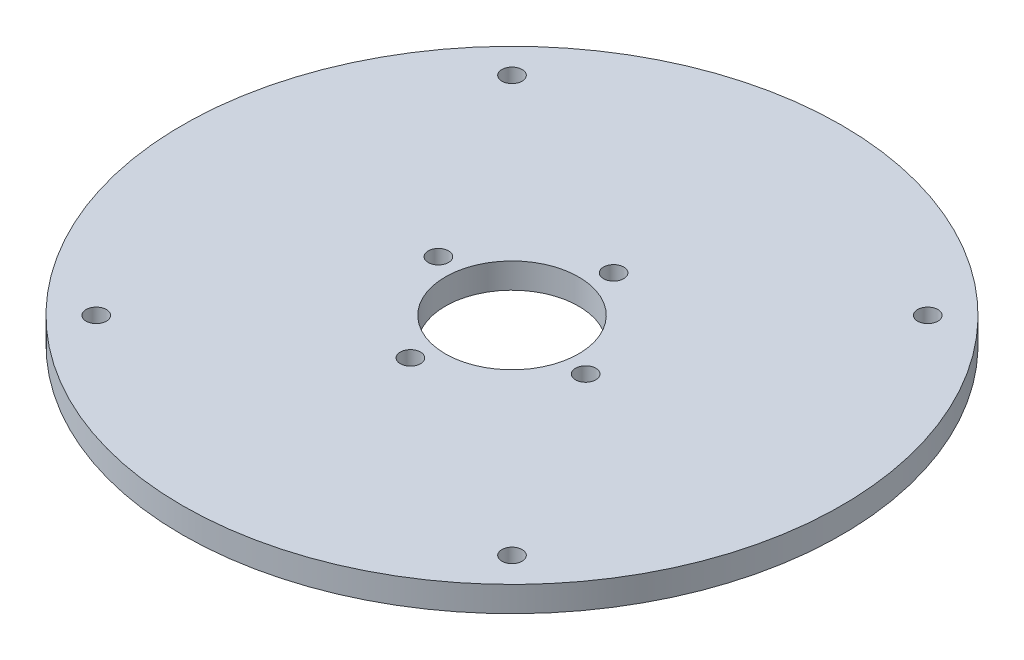
ISO-10303-21;
HEADER;
FILE_DESCRIPTION(('STEP AP214'),'2;1');
FILE_NAME('part.step','',(''),(''),'','','');
FILE_SCHEMA(('AUTOMOTIVE_DESIGN { 1 0 10303 214 1 1 1 1 }'));
ENDSEC;
DATA;
#1=APPLICATION_CONTEXT('core data for automotive mechanical design processes');
#2=APPLICATION_PROTOCOL_DEFINITION('international standard','automotive_design',2000,#1);
#3=PRODUCT_CONTEXT('',#1,'mechanical');
#4=PRODUCT('Part','Part','',(#3));
#5=PRODUCT_RELATED_PRODUCT_CATEGORY('part','',(#4));
#6=PRODUCT_DEFINITION_FORMATION('','',#4);
#7=PRODUCT_DEFINITION_CONTEXT('part definition',#1,'design');
#8=PRODUCT_DEFINITION('design','',#6,#7);
#9=PRODUCT_DEFINITION_SHAPE('','',#8);
#10=(LENGTH_UNIT() NAMED_UNIT(*) SI_UNIT(.MILLI.,.METRE.));
#11=(NAMED_UNIT(*) PLANE_ANGLE_UNIT() SI_UNIT($,.RADIAN.));
#12=(NAMED_UNIT(*) SI_UNIT($,.STERADIAN.) SOLID_ANGLE_UNIT());
#13=UNCERTAINTY_MEASURE_WITH_UNIT(LENGTH_MEASURE(1.E-05),#10,'distance_accuracy_value','');
#14=(GEOMETRIC_REPRESENTATION_CONTEXT(3) GLOBAL_UNCERTAINTY_ASSIGNED_CONTEXT((#13)) GLOBAL_UNIT_ASSIGNED_CONTEXT((#10,
#11,#12)) REPRESENTATION_CONTEXT('',''));
#15=CARTESIAN_POINT('',(0.,0.,0.));
#16=DIRECTION('',(0.,0.,1.));
#17=DIRECTION('',(1.,0.,0.));
#18=AXIS2_PLACEMENT_3D('',#15,#16,#17);
#19=CARTESIAN_POINT('',(0.,5.,0.));
#20=DIRECTION('',(0.,-1.,0.));
#21=DIRECTION('',(0.,0.,-1.));
#22=AXIS2_PLACEMENT_3D('',#19,#20,#21);
#23=CYLINDRICAL_SURFACE('',#22,65.);
#24=CARTESIAN_POINT('',(0.,5.,0.));
#25=DIRECTION('',(0.,1.,0.));
#26=DIRECTION('',(0.,0.,1.));
#27=AXIS2_PLACEMENT_3D('',#24,#25,#26);
#28=CIRCLE('',#27,65.);
#29=CARTESIAN_POINT('',(0.,5.,65.));
#30=VERTEX_POINT('',#29);
#31=EDGE_CURVE('E10',#30,#30,#28,.T.);
#32=ORIENTED_EDGE('',*,*,#31,.F.);
#33=EDGE_LOOP('',(#32));
#34=FACE_BOUND('',#33,.T.);
#35=CARTESIAN_POINT('',(0.,0.,0.));
#36=DIRECTION('',(0.,1.,0.));
#37=DIRECTION('',(0.,0.,1.));
#38=AXIS2_PLACEMENT_3D('',#35,#36,#37);
#39=CIRCLE('',#38,65.);
#40=CARTESIAN_POINT('',(0.,0.,65.));
#41=VERTEX_POINT('',#40);
#42=EDGE_CURVE('E37',#41,#41,#39,.T.);
#43=ORIENTED_EDGE('',*,*,#42,.T.);
#44=EDGE_LOOP('',(#43));
#45=FACE_BOUND('',#44,.T.);
#46=ADVANCED_FACE('F34',(#34,#45),#23,.T.);
#47=CARTESIAN_POINT('',(0.,5.,0.));
#48=DIRECTION('',(0.,1.,0.));
#49=DIRECTION('',(0.,0.,1.));
#50=AXIS2_PLACEMENT_3D('',#47,#48,#49);
#51=PLANE('',#50);
#52=CARTESIAN_POINT('',(-41.,5.,-41.));
#53=DIRECTION('',(0.,1.,0.));
#54=DIRECTION('',(0.,0.,1.));
#55=AXIS2_PLACEMENT_3D('',#52,#53,#54);
#56=CIRCLE('',#55,2.);
#57=CARTESIAN_POINT('',(-41.,5.,-39.));
#58=VERTEX_POINT('',#57);
#59=EDGE_CURVE('E85',#58,#58,#56,.T.);
#60=ORIENTED_EDGE('',*,*,#59,.F.);
#61=EDGE_LOOP('',(#60));
#62=FACE_BOUND('',#61,.T.);
#63=CARTESIAN_POINT('',(-41.,5.,41.));
#64=DIRECTION('',(0.,1.,0.));
#65=DIRECTION('',(0.,0.,1.));
#66=AXIS2_PLACEMENT_3D('',#63,#64,#65);
#67=CIRCLE('',#66,2.);
#68=CARTESIAN_POINT('',(-41.,5.,43.));
#69=VERTEX_POINT('',#68);
#70=EDGE_CURVE('E91',#69,#69,#67,.T.);
#71=ORIENTED_EDGE('',*,*,#70,.F.);
#72=EDGE_LOOP('',(#71));
#73=FACE_BOUND('',#72,.T.);
#74=CARTESIAN_POINT('',(41.,5.,41.));
#75=DIRECTION('',(0.,1.,0.));
#76=DIRECTION('',(0.,0.,1.));
#77=AXIS2_PLACEMENT_3D('',#74,#75,#76);
#78=CIRCLE('',#77,2.);
#79=CARTESIAN_POINT('',(41.,5.,43.));
#80=VERTEX_POINT('',#79);
#81=EDGE_CURVE('E79',#80,#80,#78,.T.);
#82=ORIENTED_EDGE('',*,*,#81,.F.);
#83=EDGE_LOOP('',(#82));
#84=FACE_BOUND('',#83,.T.);
#85=CARTESIAN_POINT('',(41.,5.,-41.));
#86=DIRECTION('',(0.,1.,0.));
#87=DIRECTION('',(0.,0.,1.));
#88=AXIS2_PLACEMENT_3D('',#85,#86,#87);
#89=CIRCLE('',#88,2.);
#90=CARTESIAN_POINT('',(41.,5.,-39.));
#91=VERTEX_POINT('',#90);
#92=EDGE_CURVE('E76',#91,#91,#89,.T.);
#93=ORIENTED_EDGE('',*,*,#92,.F.);
#94=EDGE_LOOP('',(#93));
#95=FACE_BOUND('',#94,.T.);
#96=CARTESIAN_POINT('',(-2.75803194997707,5.,17.2812979767987));
#97=DIRECTION('',(0.,1.,0.));
#98=DIRECTION('',(0.,0.,1.));
#99=AXIS2_PLACEMENT_3D('',#96,#97,#98);
#100=CIRCLE('',#99,2.);
#101=CARTESIAN_POINT('',(-2.75803194997707,5.,19.2812979767987));
#102=VERTEX_POINT('',#101);
#103=EDGE_CURVE('E55',#102,#102,#100,.T.);
#104=ORIENTED_EDGE('',*,*,#103,.F.);
#105=EDGE_LOOP('',(#104));
#106=FACE_BOUND('',#105,.T.);
#107=CARTESIAN_POINT('',(17.2812979767987,5.,2.75803194997703));
#108=DIRECTION('',(0.,1.,0.));
#109=DIRECTION('',(0.,0.,1.));
#110=AXIS2_PLACEMENT_3D('',#107,#108,#109);
#111=CIRCLE('',#110,2.);
#112=CARTESIAN_POINT('',(17.2812979767987,5.,4.75803194997704));
#113=VERTEX_POINT('',#112);
#114=EDGE_CURVE('E62',#113,#113,#111,.T.);
#115=ORIENTED_EDGE('',*,*,#114,.F.);
#116=EDGE_LOOP('',(#115));
#117=FACE_BOUND('',#116,.T.);
#118=CARTESIAN_POINT('',(2.758031949977,5.,-17.2812979767987));
#119=DIRECTION('',(0.,1.,0.));
#120=DIRECTION('',(0.,0.,1.));
#121=AXIS2_PLACEMENT_3D('',#118,#119,#120);
#122=CIRCLE('',#121,2.);
#123=CARTESIAN_POINT('',(2.758031949977,5.,-15.2812979767987));
#124=VERTEX_POINT('',#123);
#125=EDGE_CURVE('E68',#124,#124,#122,.T.);
#126=ORIENTED_EDGE('',*,*,#125,.F.);
#127=EDGE_LOOP('',(#126));
#128=FACE_BOUND('',#127,.T.);
#129=CARTESIAN_POINT('',(-17.2812979767986,5.,-2.75803194997716));
#130=DIRECTION('',(0.,1.,0.));
#131=DIRECTION('',(0.,0.,1.));
#132=AXIS2_PLACEMENT_3D('',#129,#130,#131);
#133=CIRCLE('',#132,2.);
#134=CARTESIAN_POINT('',(-17.2812979767986,5.,-0.758031949977161));
#135=VERTEX_POINT('',#134);
#136=EDGE_CURVE('E49',#135,#135,#133,.T.);
#137=ORIENTED_EDGE('',*,*,#136,.F.);
#138=EDGE_LOOP('',(#137));
#139=FACE_BOUND('',#138,.T.);
#140=CARTESIAN_POINT('',(0.,5.,0.));
#141=DIRECTION('',(0.,1.,0.));
#142=DIRECTION('',(0.,0.,1.));
#143=AXIS2_PLACEMENT_3D('',#140,#141,#142);
#144=CIRCLE('',#143,13.15);
#145=CARTESIAN_POINT('',(0.,5.,13.15));
#146=VERTEX_POINT('',#145);
#147=EDGE_CURVE('E46',#146,#146,#144,.T.);
#148=ORIENTED_EDGE('',*,*,#147,.F.);
#149=EDGE_LOOP('',(#148));
#150=FACE_BOUND('',#149,.T.);
#151=ORIENTED_EDGE('',*,*,#31,.T.);
#152=EDGE_LOOP('',(#151));
#153=FACE_BOUND('',#152,.T.);
#154=ADVANCED_FACE('F102',(#62,#73,#84,#95,#106,#117,#128,#139,#150,#153),#51,.T.);
#155=CARTESIAN_POINT('',(0.,0.,0.));
#156=DIRECTION('',(0.,1.,0.));
#157=DIRECTION('',(0.,0.,1.));
#158=AXIS2_PLACEMENT_3D('',#155,#156,#157);
#159=PLANE('',#158);
#160=CARTESIAN_POINT('',(-41.,0.,-41.));
#161=DIRECTION('',(0.,1.,0.));
#162=DIRECTION('',(0.,0.,1.));
#163=AXIS2_PLACEMENT_3D('',#160,#161,#162);
#164=CIRCLE('',#163,2.);
#165=CARTESIAN_POINT('',(-41.,0.,-39.));
#166=VERTEX_POINT('',#165);
#167=EDGE_CURVE('E82',#166,#166,#164,.T.);
#168=ORIENTED_EDGE('',*,*,#167,.T.);
#169=EDGE_LOOP('',(#168));
#170=FACE_BOUND('',#169,.T.);
#171=CARTESIAN_POINT('',(-41.,0.,41.));
#172=DIRECTION('',(0.,1.,0.));
#173=DIRECTION('',(0.,0.,1.));
#174=AXIS2_PLACEMENT_3D('',#171,#172,#173);
#175=CIRCLE('',#174,2.);
#176=CARTESIAN_POINT('',(-41.,0.,43.));
#177=VERTEX_POINT('',#176);
#178=EDGE_CURVE('E88',#177,#177,#175,.T.);
#179=ORIENTED_EDGE('',*,*,#178,.T.);
#180=EDGE_LOOP('',(#179));
#181=FACE_BOUND('',#180,.T.);
#182=CARTESIAN_POINT('',(41.,0.,41.));
#183=DIRECTION('',(0.,1.,0.));
#184=DIRECTION('',(0.,0.,1.));
#185=AXIS2_PLACEMENT_3D('',#182,#183,#184);
#186=CIRCLE('',#185,2.);
#187=CARTESIAN_POINT('',(41.,0.,43.));
#188=VERTEX_POINT('',#187);
#189=EDGE_CURVE('E94',#188,#188,#186,.T.);
#190=ORIENTED_EDGE('',*,*,#189,.T.);
#191=EDGE_LOOP('',(#190));
#192=FACE_BOUND('',#191,.T.);
#193=CARTESIAN_POINT('',(41.,0.,-41.));
#194=DIRECTION('',(0.,1.,0.));
#195=DIRECTION('',(0.,0.,1.));
#196=AXIS2_PLACEMENT_3D('',#193,#194,#195);
#197=CIRCLE('',#196,2.);
#198=CARTESIAN_POINT('',(41.,0.,-39.));
#199=VERTEX_POINT('',#198);
#200=EDGE_CURVE('E56',#199,#199,#197,.T.);
#201=ORIENTED_EDGE('',*,*,#200,.T.);
#202=EDGE_LOOP('',(#201));
#203=FACE_BOUND('',#202,.T.);
#204=CARTESIAN_POINT('',(-2.75803194997707,0.,17.2812979767987));
#205=DIRECTION('',(0.,1.,0.));
#206=DIRECTION('',(0.,0.,1.));
#207=AXIS2_PLACEMENT_3D('',#204,#205,#206);
#208=CIRCLE('',#207,2.);
#209=CARTESIAN_POINT('',(-2.75803194997707,0.,19.2812979767987));
#210=VERTEX_POINT('',#209);
#211=EDGE_CURVE('E52',#210,#210,#208,.T.);
#212=ORIENTED_EDGE('',*,*,#211,.T.);
#213=EDGE_LOOP('',(#212));
#214=FACE_BOUND('',#213,.T.);
#215=CARTESIAN_POINT('',(17.2812979767987,0.,2.75803194997703));
#216=DIRECTION('',(0.,1.,0.));
#217=DIRECTION('',(0.,0.,1.));
#218=AXIS2_PLACEMENT_3D('',#215,#216,#217);
#219=CIRCLE('',#218,2.);
#220=CARTESIAN_POINT('',(17.2812979767987,0.,4.75803194997704));
#221=VERTEX_POINT('',#220);
#222=EDGE_CURVE('E59',#221,#221,#219,.T.);
#223=ORIENTED_EDGE('',*,*,#222,.T.);
#224=EDGE_LOOP('',(#223));
#225=FACE_BOUND('',#224,.T.);
#226=CARTESIAN_POINT('',(2.758031949977,0.,-17.2812979767987));
#227=DIRECTION('',(0.,1.,0.));
#228=DIRECTION('',(0.,0.,1.));
#229=AXIS2_PLACEMENT_3D('',#226,#227,#228);
#230=CIRCLE('',#229,2.);
#231=CARTESIAN_POINT('',(2.758031949977,0.,-15.2812979767987));
#232=VERTEX_POINT('',#231);
#233=EDGE_CURVE('E65',#232,#232,#230,.T.);
#234=ORIENTED_EDGE('',*,*,#233,.T.);
#235=EDGE_LOOP('',(#234));
#236=FACE_BOUND('',#235,.T.);
#237=CARTESIAN_POINT('',(-17.2812979767986,0.,-2.75803194997716));
#238=DIRECTION('',(0.,1.,0.));
#239=DIRECTION('',(0.,0.,1.));
#240=AXIS2_PLACEMENT_3D('',#237,#238,#239);
#241=CIRCLE('',#240,2.);
#242=CARTESIAN_POINT('',(-17.2812979767986,0.,-0.758031949977161));
#243=VERTEX_POINT('',#242);
#244=EDGE_CURVE('E71',#243,#243,#241,.T.);
#245=ORIENTED_EDGE('',*,*,#244,.T.);
#246=EDGE_LOOP('',(#245));
#247=FACE_BOUND('',#246,.T.);
#248=CARTESIAN_POINT('',(0.,0.,0.));
#249=DIRECTION('',(0.,1.,0.));
#250=DIRECTION('',(0.,0.,1.));
#251=AXIS2_PLACEMENT_3D('',#248,#249,#250);
#252=CIRCLE('',#251,13.15);
#253=CARTESIAN_POINT('',(0.,0.,13.15));
#254=VERTEX_POINT('',#253);
#255=EDGE_CURVE('E44',#254,#254,#252,.T.);
#256=ORIENTED_EDGE('',*,*,#255,.T.);
#257=EDGE_LOOP('',(#256));
#258=FACE_BOUND('',#257,.T.);
#259=ORIENTED_EDGE('',*,*,#42,.F.);
#260=EDGE_LOOP('',(#259));
#261=FACE_BOUND('',#260,.T.);
#262=ADVANCED_FACE('F105',(#170,#181,#192,#203,#214,#225,#236,#247,#258,#261),#159,.F.);
#263=CARTESIAN_POINT('',(0.,0.,0.));
#264=DIRECTION('',(0.,1.,0.));
#265=DIRECTION('',(0.,0.,1.));
#266=AXIS2_PLACEMENT_3D('',#263,#264,#265);
#267=CYLINDRICAL_SURFACE('',#266,13.15);
#268=ORIENTED_EDGE('',*,*,#255,.F.);
#269=EDGE_LOOP('',(#268));
#270=FACE_BOUND('',#269,.T.);
#271=ORIENTED_EDGE('',*,*,#147,.T.);
#272=EDGE_LOOP('',(#271));
#273=FACE_BOUND('',#272,.T.);
#274=ADVANCED_FACE('F120',(#270,#273),#267,.F.);
#275=CARTESIAN_POINT('',(-17.2812979767986,0.,-2.75803194997716));
#276=DIRECTION('',(0.,1.,0.));
#277=DIRECTION('',(0.,0.,1.));
#278=AXIS2_PLACEMENT_3D('',#275,#276,#277);
#279=CYLINDRICAL_SURFACE('',#278,2.);
#280=ORIENTED_EDGE('',*,*,#244,.F.);
#281=EDGE_LOOP('',(#280));
#282=FACE_BOUND('',#281,.T.);
#283=ORIENTED_EDGE('',*,*,#136,.T.);
#284=EDGE_LOOP('',(#283));
#285=FACE_BOUND('',#284,.T.);
#286=ADVANCED_FACE('F122',(#282,#285),#279,.F.);
#287=CARTESIAN_POINT('',(2.758031949977,0.,-17.2812979767987));
#288=DIRECTION('',(0.,1.,0.));
#289=DIRECTION('',(0.,0.,1.));
#290=AXIS2_PLACEMENT_3D('',#287,#288,#289);
#291=CYLINDRICAL_SURFACE('',#290,2.);
#292=ORIENTED_EDGE('',*,*,#233,.F.);
#293=EDGE_LOOP('',(#292));
#294=FACE_BOUND('',#293,.T.);
#295=ORIENTED_EDGE('',*,*,#125,.T.);
#296=EDGE_LOOP('',(#295));
#297=FACE_BOUND('',#296,.T.);
#298=ADVANCED_FACE('F129',(#294,#297),#291,.F.);
#299=CARTESIAN_POINT('',(17.2812979767987,0.,2.75803194997703));
#300=DIRECTION('',(0.,1.,0.));
#301=DIRECTION('',(0.,0.,1.));
#302=AXIS2_PLACEMENT_3D('',#299,#300,#301);
#303=CYLINDRICAL_SURFACE('',#302,2.);
#304=ORIENTED_EDGE('',*,*,#222,.F.);
#305=EDGE_LOOP('',(#304));
#306=FACE_BOUND('',#305,.T.);
#307=ORIENTED_EDGE('',*,*,#114,.T.);
#308=EDGE_LOOP('',(#307));
#309=FACE_BOUND('',#308,.T.);
#310=ADVANCED_FACE('F210',(#306,#309),#303,.F.);
#311=CARTESIAN_POINT('',(-2.75803194997707,0.,17.2812979767987));
#312=DIRECTION('',(0.,1.,0.));
#313=DIRECTION('',(0.,0.,1.));
#314=AXIS2_PLACEMENT_3D('',#311,#312,#313);
#315=CYLINDRICAL_SURFACE('',#314,2.);
#316=ORIENTED_EDGE('',*,*,#211,.F.);
#317=EDGE_LOOP('',(#316));
#318=FACE_BOUND('',#317,.T.);
#319=ORIENTED_EDGE('',*,*,#103,.T.);
#320=EDGE_LOOP('',(#319));
#321=FACE_BOUND('',#320,.T.);
#322=ADVANCED_FACE('F163',(#318,#321),#315,.F.);
#323=CARTESIAN_POINT('',(41.,0.,-41.));
#324=DIRECTION('',(0.,1.,0.));
#325=DIRECTION('',(0.,0.,1.));
#326=AXIS2_PLACEMENT_3D('',#323,#324,#325);
#327=CYLINDRICAL_SURFACE('',#326,2.);
#328=ORIENTED_EDGE('',*,*,#200,.F.);
#329=EDGE_LOOP('',(#328));
#330=FACE_BOUND('',#329,.T.);
#331=ORIENTED_EDGE('',*,*,#92,.T.);
#332=EDGE_LOOP('',(#331));
#333=FACE_BOUND('',#332,.T.);
#334=ADVANCED_FACE('F158',(#330,#333),#327,.F.);
#335=CARTESIAN_POINT('',(41.,0.,41.));
#336=DIRECTION('',(0.,1.,0.));
#337=DIRECTION('',(0.,0.,1.));
#338=AXIS2_PLACEMENT_3D('',#335,#336,#337);
#339=CYLINDRICAL_SURFACE('',#338,2.);
#340=ORIENTED_EDGE('',*,*,#189,.F.);
#341=EDGE_LOOP('',(#340));
#342=FACE_BOUND('',#341,.T.);
#343=ORIENTED_EDGE('',*,*,#81,.T.);
#344=EDGE_LOOP('',(#343));
#345=FACE_BOUND('',#344,.T.);
#346=ADVANCED_FACE('F100',(#342,#345),#339,.F.);
#347=CARTESIAN_POINT('',(-41.,0.,41.));
#348=DIRECTION('',(0.,1.,0.));
#349=DIRECTION('',(0.,0.,1.));
#350=AXIS2_PLACEMENT_3D('',#347,#348,#349);
#351=CYLINDRICAL_SURFACE('',#350,2.);
#352=ORIENTED_EDGE('',*,*,#178,.F.);
#353=EDGE_LOOP('',(#352));
#354=FACE_BOUND('',#353,.T.);
#355=ORIENTED_EDGE('',*,*,#70,.T.);
#356=EDGE_LOOP('',(#355));
#357=FACE_BOUND('',#356,.T.);
#358=ADVANCED_FACE('F176',(#354,#357),#351,.F.);
#359=CARTESIAN_POINT('',(-41.,0.,-41.));
#360=DIRECTION('',(0.,1.,0.));
#361=DIRECTION('',(0.,0.,1.));
#362=AXIS2_PLACEMENT_3D('',#359,#360,#361);
#363=CYLINDRICAL_SURFACE('',#362,2.);
#364=ORIENTED_EDGE('',*,*,#167,.F.);
#365=EDGE_LOOP('',(#364));
#366=FACE_BOUND('',#365,.T.);
#367=ORIENTED_EDGE('',*,*,#59,.T.);
#368=EDGE_LOOP('',(#367));
#369=FACE_BOUND('',#368,.T.);
#370=ADVANCED_FACE('F187',(#366,#369),#363,.F.);
#371=CLOSED_SHELL('',(#46,#154,#262,#274,#286,#298,#310,#322,#334,#346,#358,#370));
#372=MANIFOLD_SOLID_BREP('B2',#371);
#373=ADVANCED_BREP_SHAPE_REPRESENTATION('',(#18,#372),#14);
#374=SHAPE_DEFINITION_REPRESENTATION(#9,#373);
ENDSEC;
END-ISO-10303-21;
